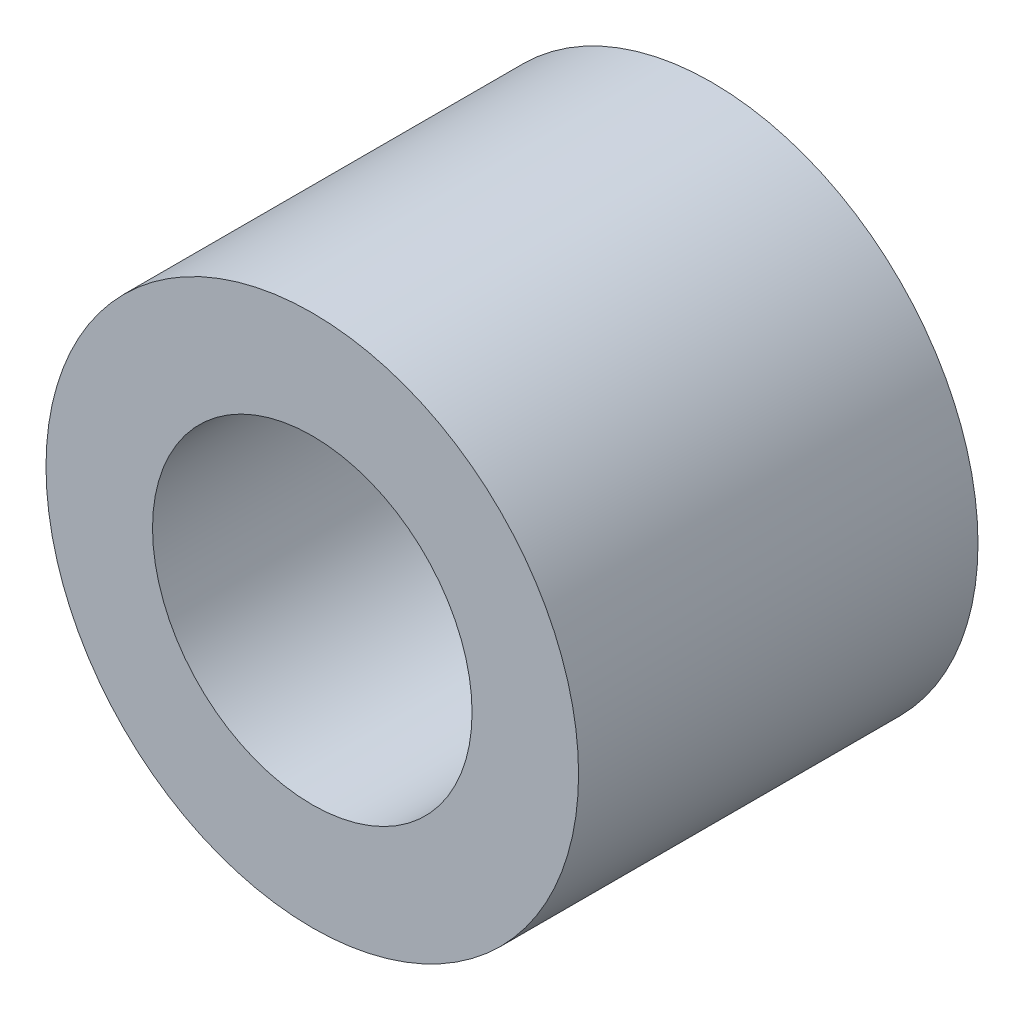
ISO-10303-21;
HEADER;
FILE_DESCRIPTION(('STEP AP214'),'2;1');
FILE_NAME('part.step','',(''),(''),'','','');
FILE_SCHEMA(('AUTOMOTIVE_DESIGN { 1 0 10303 214 1 1 1 1 }'));
ENDSEC;
DATA;
#1=APPLICATION_CONTEXT('core data for automotive mechanical design processes');
#2=APPLICATION_PROTOCOL_DEFINITION('international standard','automotive_design',2000,#1);
#3=PRODUCT_CONTEXT('',#1,'mechanical');
#4=PRODUCT('Part','Part','',(#3));
#5=PRODUCT_RELATED_PRODUCT_CATEGORY('part','',(#4));
#6=PRODUCT_DEFINITION_FORMATION('','',#4);
#7=PRODUCT_DEFINITION_CONTEXT('part definition',#1,'design');
#8=PRODUCT_DEFINITION('design','',#6,#7);
#9=PRODUCT_DEFINITION_SHAPE('','',#8);
#10=(LENGTH_UNIT() NAMED_UNIT(*) SI_UNIT(.MILLI.,.METRE.));
#11=(NAMED_UNIT(*) PLANE_ANGLE_UNIT() SI_UNIT($,.RADIAN.));
#12=(NAMED_UNIT(*) SI_UNIT($,.STERADIAN.) SOLID_ANGLE_UNIT());
#13=UNCERTAINTY_MEASURE_WITH_UNIT(LENGTH_MEASURE(1.E-05),#10,'distance_accuracy_value','');
#14=(GEOMETRIC_REPRESENTATION_CONTEXT(3) GLOBAL_UNCERTAINTY_ASSIGNED_CONTEXT((#13)) GLOBAL_UNIT_ASSIGNED_CONTEXT((#10,
#11,#12)) REPRESENTATION_CONTEXT('',''));
#15=CARTESIAN_POINT('',(0.,0.,0.));
#16=DIRECTION('',(0.,0.,1.));
#17=DIRECTION('',(1.,0.,0.));
#18=AXIS2_PLACEMENT_3D('',#15,#16,#17);
#19=CARTESIAN_POINT('',(0.,0.,3.));
#20=DIRECTION('',(0.,0.,1.));
#21=DIRECTION('',(1.,0.,0.));
#22=AXIS2_PLACEMENT_3D('',#19,#20,#21);
#23=PLANE('',#22);
#24=CARTESIAN_POINT('',(0.,0.,3.));
#25=DIRECTION('',(0.,0.,1.));
#26=DIRECTION('',(1.,0.,0.));
#27=AXIS2_PLACEMENT_3D('',#24,#25,#26);
#28=CIRCLE('',#27,2.);
#29=CARTESIAN_POINT('',(2.,0.,3.));
#30=VERTEX_POINT('',#29);
#31=EDGE_CURVE('E10',#30,#30,#28,.T.);
#32=ORIENTED_EDGE('',*,*,#31,.T.);
#33=EDGE_LOOP('',(#32));
#34=FACE_BOUND('',#33,.T.);
#35=CARTESIAN_POINT('',(0.,0.,3.));
#36=DIRECTION('',(0.,0.,1.));
#37=DIRECTION('',(1.,0.,0.));
#38=AXIS2_PLACEMENT_3D('',#35,#36,#37);
#39=CIRCLE('',#38,1.2);
#40=CARTESIAN_POINT('',(1.2,0.,3.));
#41=VERTEX_POINT('',#40);
#42=EDGE_CURVE('E50',#41,#41,#39,.T.);
#43=ORIENTED_EDGE('',*,*,#42,.F.);
#44=EDGE_LOOP('',(#43));
#45=FACE_BOUND('',#44,.T.);
#46=ADVANCED_FACE('F37',(#34,#45),#23,.T.);
#47=CARTESIAN_POINT('',(0.,0.,0.));
#48=DIRECTION('',(0.,0.,1.));
#49=DIRECTION('',(1.,0.,0.));
#50=AXIS2_PLACEMENT_3D('',#47,#48,#49);
#51=PLANE('',#50);
#52=CARTESIAN_POINT('',(0.,0.,0.));
#53=DIRECTION('',(0.,0.,1.));
#54=DIRECTION('',(1.,0.,0.));
#55=AXIS2_PLACEMENT_3D('',#52,#53,#54);
#56=CIRCLE('',#55,2.);
#57=CARTESIAN_POINT('',(2.,0.,0.));
#58=VERTEX_POINT('',#57);
#59=EDGE_CURVE('E41',#58,#58,#56,.T.);
#60=ORIENTED_EDGE('',*,*,#59,.F.);
#61=EDGE_LOOP('',(#60));
#62=FACE_BOUND('',#61,.T.);
#63=CARTESIAN_POINT('',(0.,0.,0.));
#64=DIRECTION('',(0.,0.,1.));
#65=DIRECTION('',(1.,0.,0.));
#66=AXIS2_PLACEMENT_3D('',#63,#64,#65);
#67=CIRCLE('',#66,1.2);
#68=CARTESIAN_POINT('',(1.2,0.,0.));
#69=VERTEX_POINT('',#68);
#70=EDGE_CURVE('E52',#69,#69,#67,.T.);
#71=ORIENTED_EDGE('',*,*,#70,.T.);
#72=EDGE_LOOP('',(#71));
#73=FACE_BOUND('',#72,.T.);
#74=ADVANCED_FACE('F64',(#62,#73),#51,.F.);
#75=CARTESIAN_POINT('',(0.,0.,3.));
#76=DIRECTION('',(0.,0.,-1.));
#77=DIRECTION('',(-1.,0.,0.));
#78=AXIS2_PLACEMENT_3D('',#75,#76,#77);
#79=CYLINDRICAL_SURFACE('',#78,2.);
#80=ORIENTED_EDGE('',*,*,#31,.F.);
#81=EDGE_LOOP('',(#80));
#82=FACE_BOUND('',#81,.T.);
#83=ORIENTED_EDGE('',*,*,#59,.T.);
#84=EDGE_LOOP('',(#83));
#85=FACE_BOUND('',#84,.T.);
#86=ADVANCED_FACE('F39',(#82,#85),#79,.T.);
#87=CARTESIAN_POINT('',(0.,0.,3.));
#88=DIRECTION('',(0.,0.,-1.));
#89=DIRECTION('',(-1.,0.,0.));
#90=AXIS2_PLACEMENT_3D('',#87,#88,#89);
#91=CYLINDRICAL_SURFACE('',#90,1.2);
#92=ORIENTED_EDGE('',*,*,#42,.T.);
#93=EDGE_LOOP('',(#92));
#94=FACE_BOUND('',#93,.T.);
#95=ORIENTED_EDGE('',*,*,#70,.F.);
#96=EDGE_LOOP('',(#95));
#97=FACE_BOUND('',#96,.T.);
#98=ADVANCED_FACE('F60',(#94,#97),#91,.F.);
#99=CLOSED_SHELL('',(#46,#74,#86,#98));
#100=MANIFOLD_SOLID_BREP('B2',#99);
#101=ADVANCED_BREP_SHAPE_REPRESENTATION('',(#18,#100),#14);
#102=SHAPE_DEFINITION_REPRESENTATION(#9,#101);
ENDSEC;
END-ISO-10303-21;
